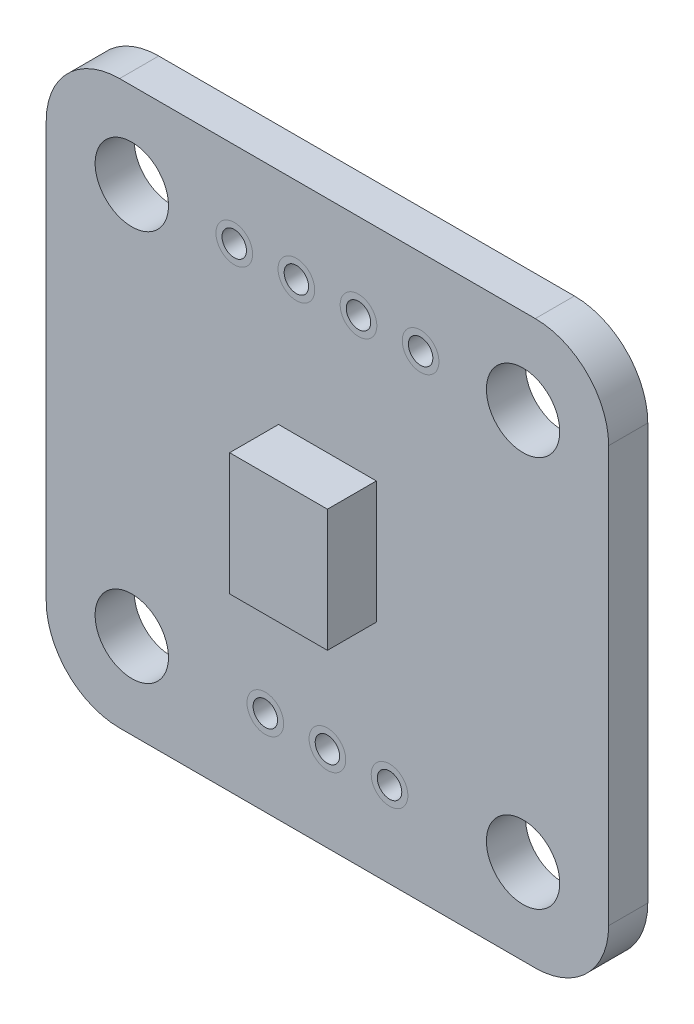
ISO-10303-21;
HEADER;
FILE_DESCRIPTION(('STEP AP214'),'2;1');
FILE_NAME('part.step','',(''),(''),'','','');
FILE_SCHEMA(('AUTOMOTIVE_DESIGN { 1 0 10303 214 1 1 1 1 }'));
ENDSEC;
DATA;
#1=APPLICATION_CONTEXT('core data for automotive mechanical design processes');
#2=APPLICATION_PROTOCOL_DEFINITION('international standard','automotive_design',2000,#1);
#3=PRODUCT_CONTEXT('',#1,'mechanical');
#4=PRODUCT('Part','Part','',(#3));
#5=PRODUCT_RELATED_PRODUCT_CATEGORY('part','',(#4));
#6=PRODUCT_DEFINITION_FORMATION('','',#4);
#7=PRODUCT_DEFINITION_CONTEXT('part definition',#1,'design');
#8=PRODUCT_DEFINITION('design','',#6,#7);
#9=PRODUCT_DEFINITION_SHAPE('','',#8);
#10=(LENGTH_UNIT() NAMED_UNIT(*) SI_UNIT(.MILLI.,.METRE.));
#11=(NAMED_UNIT(*) PLANE_ANGLE_UNIT() SI_UNIT($,.RADIAN.));
#12=(NAMED_UNIT(*) SI_UNIT($,.STERADIAN.) SOLID_ANGLE_UNIT());
#13=UNCERTAINTY_MEASURE_WITH_UNIT(LENGTH_MEASURE(1.E-05),#10,'distance_accuracy_value','');
#14=(GEOMETRIC_REPRESENTATION_CONTEXT(3) GLOBAL_UNCERTAINTY_ASSIGNED_CONTEXT((#13)) GLOBAL_UNIT_ASSIGNED_CONTEXT((#10,
#11,#12)) REPRESENTATION_CONTEXT('',''));
#15=CARTESIAN_POINT('',(0.,0.,0.));
#16=DIRECTION('',(0.,0.,1.));
#17=DIRECTION('',(1.,0.,0.));
#18=AXIS2_PLACEMENT_3D('',#15,#16,#17);
#19=CARTESIAN_POINT('',(-8.50000000000001,-8.5,-0.8));
#20=DIRECTION('',(0.,0.,-1.));
#21=DIRECTION('',(-1.,0.,0.));
#22=AXIS2_PLACEMENT_3D('',#19,#20,#21);
#23=PLANE('',#22);
#24=CARTESIAN_POINT('',(0.,-7.99999999999999,-0.8));
#25=DIRECTION('',(0.,0.,-1.));
#26=DIRECTION('',(-1.,0.,0.));
#27=AXIS2_PLACEMENT_3D('',#24,#25,#26);
#28=CIRCLE('',#27,0.75);
#29=CARTESIAN_POINT('',(-0.75,-7.99999999999999,-0.8));
#30=VERTEX_POINT('',#29);
#31=EDGE_CURVE('E321',#30,#30,#28,.F.);
#32=ORIENTED_EDGE('',*,*,#31,.T.);
#33=EDGE_LOOP('',(#32));
#34=FACE_BOUND('',#33,.T.);
#35=CARTESIAN_POINT('',(3.81,7.99999999999999,-0.8));
#36=DIRECTION('',(0.,0.,-1.));
#37=DIRECTION('',(-1.,0.,0.));
#38=AXIS2_PLACEMENT_3D('',#35,#36,#37);
#39=CIRCLE('',#38,0.75);
#40=CARTESIAN_POINT('',(3.06,7.99999999999999,-0.8));
#41=VERTEX_POINT('',#40);
#42=EDGE_CURVE('E305',#41,#41,#39,.F.);
#43=ORIENTED_EDGE('',*,*,#42,.T.);
#44=EDGE_LOOP('',(#43));
#45=FACE_BOUND('',#44,.T.);
#46=CARTESIAN_POINT('',(-1.27,7.99999999999999,-0.8));
#47=DIRECTION('',(0.,0.,-1.));
#48=DIRECTION('',(-1.,0.,0.));
#49=AXIS2_PLACEMENT_3D('',#46,#47,#48);
#50=CIRCLE('',#49,0.75);
#51=CARTESIAN_POINT('',(-2.02,7.99999999999999,-0.8));
#52=VERTEX_POINT('',#51);
#53=EDGE_CURVE('E289',#52,#52,#50,.F.);
#54=ORIENTED_EDGE('',*,*,#53,.T.);
#55=EDGE_LOOP('',(#54));
#56=FACE_BOUND('',#55,.T.);
#57=CARTESIAN_POINT('',(8.,-7.99999999999999,-0.8));
#58=DIRECTION('',(0.,0.,1.));
#59=DIRECTION('',(1.,0.,0.));
#60=AXIS2_PLACEMENT_3D('',#57,#58,#59);
#61=CIRCLE('',#60,1.5);
#62=CARTESIAN_POINT('',(9.5,-7.99999999999999,-0.8));
#63=VERTEX_POINT('',#62);
#64=EDGE_CURVE('E202',#63,#63,#61,.T.);
#65=ORIENTED_EDGE('',*,*,#64,.T.);
#66=EDGE_LOOP('',(#65));
#67=FACE_BOUND('',#66,.T.);
#68=CARTESIAN_POINT('',(-8.,7.99999999999999,-0.8));
#69=DIRECTION('',(0.,0.,1.));
#70=DIRECTION('',(1.,0.,0.));
#71=AXIS2_PLACEMENT_3D('',#68,#69,#70);
#72=CIRCLE('',#71,1.5);
#73=CARTESIAN_POINT('',(-6.5,7.99999999999999,-0.8));
#74=VERTEX_POINT('',#73);
#75=EDGE_CURVE('E214',#74,#74,#72,.T.);
#76=ORIENTED_EDGE('',*,*,#75,.T.);
#77=EDGE_LOOP('',(#76));
#78=FACE_BOUND('',#77,.T.);
#79=CARTESIAN_POINT('',(-8.50000000000001,-8.5,-0.8));
#80=DIRECTION('',(0.,0.,1.));
#81=DIRECTION('',(-1.,0.,0.));
#82=AXIS2_PLACEMENT_3D('',#79,#80,#81);
#83=CIRCLE('',#82,3.);
#84=CARTESIAN_POINT('',(-11.5,-8.49999999999998,-0.8));
#85=VERTEX_POINT('',#84);
#86=CARTESIAN_POINT('',(-8.49999999999998,-11.5,-0.8));
#87=VERTEX_POINT('',#86);
#88=EDGE_CURVE('E220',#85,#87,#83,.T.);
#89=ORIENTED_EDGE('',*,*,#88,.F.);
#90=DIRECTION('',(0.,-1.,0.));
#91=VECTOR('',#90,1.);
#92=CARTESIAN_POINT('',(-11.5,-8.49999999999998,-0.8));
#93=LINE('',#92,#91);
#94=CARTESIAN_POINT('',(-11.5,8.49999999999998,-0.8));
#95=VERTEX_POINT('',#94);
#96=EDGE_CURVE('E227',#95,#85,#93,.T.);
#97=ORIENTED_EDGE('',*,*,#96,.F.);
#98=CARTESIAN_POINT('',(-8.50000000000001,8.5,-0.8));
#99=DIRECTION('',(0.,0.,1.));
#100=DIRECTION('',(-1.,0.,0.));
#101=AXIS2_PLACEMENT_3D('',#98,#99,#100);
#102=CIRCLE('',#101,3.);
#103=CARTESIAN_POINT('',(-8.49999999999998,11.5,-0.8));
#104=VERTEX_POINT('',#103);
#105=EDGE_CURVE('E254',#104,#95,#102,.T.);
#106=ORIENTED_EDGE('',*,*,#105,.F.);
#107=DIRECTION('',(-1.,0.,0.));
#108=VECTOR('',#107,1.);
#109=CARTESIAN_POINT('',(-8.49999999999998,11.5,-0.8));
#110=LINE('',#109,#108);
#111=CARTESIAN_POINT('',(8.49999999999997,11.5,-0.8));
#112=VERTEX_POINT('',#111);
#113=EDGE_CURVE('E252',#112,#104,#110,.T.);
#114=ORIENTED_EDGE('',*,*,#113,.F.);
#115=CARTESIAN_POINT('',(8.49999999999999,8.5,-0.8));
#116=DIRECTION('',(0.,0.,1.));
#117=DIRECTION('',(-1.,0.,0.));
#118=AXIS2_PLACEMENT_3D('',#115,#116,#117);
#119=CIRCLE('',#118,3.);
#120=CARTESIAN_POINT('',(11.5,8.49999999999998,-0.8));
#121=VERTEX_POINT('',#120);
#122=EDGE_CURVE('E250',#121,#112,#119,.T.);
#123=ORIENTED_EDGE('',*,*,#122,.F.);
#124=DIRECTION('',(0.,1.,0.));
#125=VECTOR('',#124,1.);
#126=CARTESIAN_POINT('',(11.5,-8.49999999999998,-0.8));
#127=LINE('',#126,#125);
#128=CARTESIAN_POINT('',(11.5,-8.5,-0.8));
#129=VERTEX_POINT('',#128);
#130=EDGE_CURVE('E248',#129,#121,#127,.T.);
#131=ORIENTED_EDGE('',*,*,#130,.F.);
#132=CARTESIAN_POINT('',(8.49999999999999,-8.5,-0.8));
#133=DIRECTION('',(0.,0.,1.));
#134=DIRECTION('',(1.,0.,0.));
#135=AXIS2_PLACEMENT_3D('',#132,#133,#134);
#136=CIRCLE('',#135,3.);
#137=CARTESIAN_POINT('',(8.49999999999997,-11.5,-0.8));
#138=VERTEX_POINT('',#137);
#139=EDGE_CURVE('E246',#138,#129,#136,.T.);
#140=ORIENTED_EDGE('',*,*,#139,.F.);
#141=DIRECTION('',(1.,0.,0.));
#142=VECTOR('',#141,1.);
#143=CARTESIAN_POINT('',(-8.49999999999998,-11.5,-0.8));
#144=LINE('',#143,#142);
#145=EDGE_CURVE('E244',#87,#138,#144,.T.);
#146=ORIENTED_EDGE('',*,*,#145,.F.);
#147=EDGE_LOOP('',(#89,#97,#106,#114,#123,#131,#140,#146));
#148=FACE_BOUND('',#147,.T.);
#149=CARTESIAN_POINT('',(8.,7.99999999999999,-0.8));
#150=DIRECTION('',(0.,0.,1.));
#151=DIRECTION('',(1.,0.,0.));
#152=AXIS2_PLACEMENT_3D('',#149,#150,#151);
#153=CIRCLE('',#152,1.5);
#154=CARTESIAN_POINT('',(9.5,7.99999999999999,-0.8));
#155=VERTEX_POINT('',#154);
#156=EDGE_CURVE('E208',#155,#155,#153,.T.);
#157=ORIENTED_EDGE('',*,*,#156,.T.);
#158=EDGE_LOOP('',(#157));
#159=FACE_BOUND('',#158,.T.);
#160=CARTESIAN_POINT('',(-8.,-7.99999999999999,-0.8));
#161=DIRECTION('',(0.,0.,1.));
#162=DIRECTION('',(1.,0.,0.));
#163=AXIS2_PLACEMENT_3D('',#160,#161,#162);
#164=CIRCLE('',#163,1.5);
#165=CARTESIAN_POINT('',(-6.5,-7.99999999999999,-0.8));
#166=VERTEX_POINT('',#165);
#167=EDGE_CURVE('E196',#166,#166,#164,.T.);
#168=ORIENTED_EDGE('',*,*,#167,.T.);
#169=EDGE_LOOP('',(#168));
#170=FACE_BOUND('',#169,.T.);
#171=CARTESIAN_POINT('',(-3.81,7.99999999999999,-0.8));
#172=DIRECTION('',(0.,0.,-1.));
#173=DIRECTION('',(-1.,0.,0.));
#174=AXIS2_PLACEMENT_3D('',#171,#172,#173);
#175=CIRCLE('',#174,0.75);
#176=CARTESIAN_POINT('',(-4.56,7.99999999999999,-0.8));
#177=VERTEX_POINT('',#176);
#178=EDGE_CURVE('E281',#177,#177,#175,.F.);
#179=ORIENTED_EDGE('',*,*,#178,.T.);
#180=EDGE_LOOP('',(#179));
#181=FACE_BOUND('',#180,.T.);
#182=CARTESIAN_POINT('',(1.27,7.99999999999999,-0.8));
#183=DIRECTION('',(0.,0.,-1.));
#184=DIRECTION('',(-1.,0.,0.));
#185=AXIS2_PLACEMENT_3D('',#182,#183,#184);
#186=CIRCLE('',#185,0.75);
#187=CARTESIAN_POINT('',(0.519999999999999,7.99999999999999,-0.8));
#188=VERTEX_POINT('',#187);
#189=EDGE_CURVE('E297',#188,#188,#186,.F.);
#190=ORIENTED_EDGE('',*,*,#189,.T.);
#191=EDGE_LOOP('',(#190));
#192=FACE_BOUND('',#191,.T.);
#193=CARTESIAN_POINT('',(-2.54,-7.99999999999999,-0.8));
#194=DIRECTION('',(0.,0.,-1.));
#195=DIRECTION('',(-1.,0.,0.));
#196=AXIS2_PLACEMENT_3D('',#193,#194,#195);
#197=CIRCLE('',#196,0.75);
#198=CARTESIAN_POINT('',(-3.29,-7.99999999999999,-0.8));
#199=VERTEX_POINT('',#198);
#200=EDGE_CURVE('E313',#199,#199,#197,.F.);
#201=ORIENTED_EDGE('',*,*,#200,.T.);
#202=EDGE_LOOP('',(#201));
#203=FACE_BOUND('',#202,.T.);
#204=CARTESIAN_POINT('',(2.54,-7.99999999999999,-0.8));
#205=DIRECTION('',(0.,0.,-1.));
#206=DIRECTION('',(-1.,0.,0.));
#207=AXIS2_PLACEMENT_3D('',#204,#205,#206);
#208=CIRCLE('',#207,0.75);
#209=CARTESIAN_POINT('',(1.79,-7.99999999999999,-0.8));
#210=VERTEX_POINT('',#209);
#211=EDGE_CURVE('E11',#210,#210,#208,.F.);
#212=ORIENTED_EDGE('',*,*,#211,.T.);
#213=EDGE_LOOP('',(#212));
#214=FACE_BOUND('',#213,.T.);
#215=ADVANCED_FACE('F40',(#34,#45,#56,#67,#78,#148,#159,#170,#181,#192,#203,#214),#23,.T.);
#216=CARTESIAN_POINT('',(-8.50000000000001,-8.5,0.8));
#217=DIRECTION('',(0.,0.,-1.));
#218=DIRECTION('',(-1.,0.,0.));
#219=AXIS2_PLACEMENT_3D('',#216,#217,#218);
#220=PLANE('',#219);
#221=CARTESIAN_POINT('',(0.,-7.99999999999999,0.8));
#222=DIRECTION('',(0.,0.,-1.));
#223=DIRECTION('',(-1.,0.,0.));
#224=AXIS2_PLACEMENT_3D('',#221,#222,#223);
#225=CIRCLE('',#224,0.75);
#226=CARTESIAN_POINT('',(-0.75,-7.99999999999999,0.8));
#227=VERTEX_POINT('',#226);
#228=EDGE_CURVE('E317',#227,#227,#225,.F.);
#229=ORIENTED_EDGE('',*,*,#228,.F.);
#230=EDGE_LOOP('',(#229));
#231=FACE_BOUND('',#230,.T.);
#232=CARTESIAN_POINT('',(3.81,7.99999999999999,0.8));
#233=DIRECTION('',(0.,0.,-1.));
#234=DIRECTION('',(-1.,0.,0.));
#235=AXIS2_PLACEMENT_3D('',#232,#233,#234);
#236=CIRCLE('',#235,0.75);
#237=CARTESIAN_POINT('',(3.06,7.99999999999999,0.8));
#238=VERTEX_POINT('',#237);
#239=EDGE_CURVE('E301',#238,#238,#236,.F.);
#240=ORIENTED_EDGE('',*,*,#239,.F.);
#241=EDGE_LOOP('',(#240));
#242=FACE_BOUND('',#241,.T.);
#243=CARTESIAN_POINT('',(-1.27,7.99999999999999,0.8));
#244=DIRECTION('',(0.,0.,-1.));
#245=DIRECTION('',(-1.,0.,0.));
#246=AXIS2_PLACEMENT_3D('',#243,#244,#245);
#247=CIRCLE('',#246,0.75);
#248=CARTESIAN_POINT('',(-2.02,7.99999999999999,0.8));
#249=VERTEX_POINT('',#248);
#250=EDGE_CURVE('E285',#249,#249,#247,.F.);
#251=ORIENTED_EDGE('',*,*,#250,.F.);
#252=EDGE_LOOP('',(#251));
#253=FACE_BOUND('',#252,.T.);
#254=DIRECTION('',(0.,1.,0.));
#255=VECTOR('',#254,1.);
#256=CARTESIAN_POINT('',(2.,2.5,0.8));
#257=LINE('',#256,#255);
#258=CARTESIAN_POINT('',(2.,-2.5,0.8));
#259=VERTEX_POINT('',#258);
#260=CARTESIAN_POINT('',(2.,2.5,0.8));
#261=VERTEX_POINT('',#260);
#262=EDGE_CURVE('E150',#259,#261,#257,.T.);
#263=ORIENTED_EDGE('',*,*,#262,.F.);
#264=DIRECTION('',(1.,0.,0.));
#265=VECTOR('',#264,1.);
#266=CARTESIAN_POINT('',(-2.,-2.5,0.8));
#267=LINE('',#266,#265);
#268=CARTESIAN_POINT('',(-2.,-2.5,0.8));
#269=VERTEX_POINT('',#268);
#270=EDGE_CURVE('E147',#269,#259,#267,.T.);
#271=ORIENTED_EDGE('',*,*,#270,.F.);
#272=DIRECTION('',(0.,-1.,0.));
#273=VECTOR('',#272,1.);
#274=CARTESIAN_POINT('',(-2.,2.5,0.8));
#275=LINE('',#274,#273);
#276=CARTESIAN_POINT('',(-2.,2.5,0.8));
#277=VERTEX_POINT('',#276);
#278=EDGE_CURVE('E61',#277,#269,#275,.T.);
#279=ORIENTED_EDGE('',*,*,#278,.F.);
#280=DIRECTION('',(-1.,0.,0.));
#281=VECTOR('',#280,1.);
#282=CARTESIAN_POINT('',(-2.,2.5,0.8));
#283=LINE('',#282,#281);
#284=EDGE_CURVE('E56',#261,#277,#283,.T.);
#285=ORIENTED_EDGE('',*,*,#284,.F.);
#286=EDGE_LOOP('',(#263,#271,#279,#285));
#287=FACE_BOUND('',#286,.T.);
#288=CARTESIAN_POINT('',(-8.50000000000001,-8.5,0.8));
#289=DIRECTION('',(0.,0.,1.));
#290=DIRECTION('',(-1.,0.,0.));
#291=AXIS2_PLACEMENT_3D('',#288,#289,#290);
#292=CIRCLE('',#291,3.);
#293=CARTESIAN_POINT('',(-11.5,-8.49999999999998,0.8));
#294=VERTEX_POINT('',#293);
#295=CARTESIAN_POINT('',(-8.49999999999998,-11.5,0.8));
#296=VERTEX_POINT('',#295);
#297=EDGE_CURVE('E223',#294,#296,#292,.T.);
#298=ORIENTED_EDGE('',*,*,#297,.T.);
#299=DIRECTION('',(1.,0.,0.));
#300=VECTOR('',#299,1.);
#301=CARTESIAN_POINT('',(-8.49999999999998,-11.5,0.8));
#302=LINE('',#301,#300);
#303=CARTESIAN_POINT('',(8.49999999999997,-11.5,0.8));
#304=VERTEX_POINT('',#303);
#305=EDGE_CURVE('E226',#296,#304,#302,.T.);
#306=ORIENTED_EDGE('',*,*,#305,.T.);
#307=CARTESIAN_POINT('',(8.49999999999999,-8.5,0.8));
#308=DIRECTION('',(0.,0.,1.));
#309=DIRECTION('',(1.,0.,0.));
#310=AXIS2_PLACEMENT_3D('',#307,#308,#309);
#311=CIRCLE('',#310,3.);
#312=CARTESIAN_POINT('',(11.5,-8.5,0.8));
#313=VERTEX_POINT('',#312);
#314=EDGE_CURVE('E229',#304,#313,#311,.T.);
#315=ORIENTED_EDGE('',*,*,#314,.T.);
#316=DIRECTION('',(0.,1.,0.));
#317=VECTOR('',#316,1.);
#318=CARTESIAN_POINT('',(11.5,-8.49999999999998,0.8));
#319=LINE('',#318,#317);
#320=CARTESIAN_POINT('',(11.5,8.49999999999998,0.8));
#321=VERTEX_POINT('',#320);
#322=EDGE_CURVE('E231',#313,#321,#319,.T.);
#323=ORIENTED_EDGE('',*,*,#322,.T.);
#324=CARTESIAN_POINT('',(8.49999999999999,8.5,0.8));
#325=DIRECTION('',(0.,0.,1.));
#326=DIRECTION('',(-1.,0.,0.));
#327=AXIS2_PLACEMENT_3D('',#324,#325,#326);
#328=CIRCLE('',#327,3.);
#329=CARTESIAN_POINT('',(8.49999999999997,11.5,0.8));
#330=VERTEX_POINT('',#329);
#331=EDGE_CURVE('E233',#321,#330,#328,.T.);
#332=ORIENTED_EDGE('',*,*,#331,.T.);
#333=DIRECTION('',(-1.,0.,0.));
#334=VECTOR('',#333,1.);
#335=CARTESIAN_POINT('',(-8.49999999999998,11.5,0.8));
#336=LINE('',#335,#334);
#337=CARTESIAN_POINT('',(-8.49999999999998,11.5,0.8));
#338=VERTEX_POINT('',#337);
#339=EDGE_CURVE('E235',#330,#338,#336,.T.);
#340=ORIENTED_EDGE('',*,*,#339,.T.);
#341=CARTESIAN_POINT('',(-8.50000000000001,8.5,0.8));
#342=DIRECTION('',(0.,0.,1.));
#343=DIRECTION('',(-1.,0.,0.));
#344=AXIS2_PLACEMENT_3D('',#341,#342,#343);
#345=CIRCLE('',#344,3.);
#346=CARTESIAN_POINT('',(-11.5,8.49999999999998,0.8));
#347=VERTEX_POINT('',#346);
#348=EDGE_CURVE('E237',#338,#347,#345,.T.);
#349=ORIENTED_EDGE('',*,*,#348,.T.);
#350=DIRECTION('',(0.,-1.,0.));
#351=VECTOR('',#350,1.);
#352=CARTESIAN_POINT('',(-11.5,-8.49999999999998,0.8));
#353=LINE('',#352,#351);
#354=EDGE_CURVE('E239',#347,#294,#353,.T.);
#355=ORIENTED_EDGE('',*,*,#354,.T.);
#356=EDGE_LOOP('',(#298,#306,#315,#323,#332,#340,#349,#355));
#357=FACE_BOUND('',#356,.T.);
#358=CARTESIAN_POINT('',(-8.,7.99999999999999,0.8));
#359=DIRECTION('',(0.,0.,1.));
#360=DIRECTION('',(1.,0.,0.));
#361=AXIS2_PLACEMENT_3D('',#358,#359,#360);
#362=CIRCLE('',#361,1.5);
#363=CARTESIAN_POINT('',(-6.5,7.99999999999999,0.8));
#364=VERTEX_POINT('',#363);
#365=EDGE_CURVE('E217',#364,#364,#362,.T.);
#366=ORIENTED_EDGE('',*,*,#365,.F.);
#367=EDGE_LOOP('',(#366));
#368=FACE_BOUND('',#367,.T.);
#369=CARTESIAN_POINT('',(8.,7.99999999999999,0.8));
#370=DIRECTION('',(0.,0.,1.));
#371=DIRECTION('',(1.,0.,0.));
#372=AXIS2_PLACEMENT_3D('',#369,#370,#371);
#373=CIRCLE('',#372,1.5);
#374=CARTESIAN_POINT('',(9.5,7.99999999999999,0.8));
#375=VERTEX_POINT('',#374);
#376=EDGE_CURVE('E211',#375,#375,#373,.T.);
#377=ORIENTED_EDGE('',*,*,#376,.F.);
#378=EDGE_LOOP('',(#377));
#379=FACE_BOUND('',#378,.T.);
#380=CARTESIAN_POINT('',(8.,-7.99999999999999,0.8));
#381=DIRECTION('',(0.,0.,1.));
#382=DIRECTION('',(1.,0.,0.));
#383=AXIS2_PLACEMENT_3D('',#380,#381,#382);
#384=CIRCLE('',#383,1.5);
#385=CARTESIAN_POINT('',(9.5,-7.99999999999999,0.8));
#386=VERTEX_POINT('',#385);
#387=EDGE_CURVE('E205',#386,#386,#384,.T.);
#388=ORIENTED_EDGE('',*,*,#387,.F.);
#389=EDGE_LOOP('',(#388));
#390=FACE_BOUND('',#389,.T.);
#391=CARTESIAN_POINT('',(-8.,-7.99999999999999,0.8));
#392=DIRECTION('',(0.,0.,1.));
#393=DIRECTION('',(1.,0.,0.));
#394=AXIS2_PLACEMENT_3D('',#391,#392,#393);
#395=CIRCLE('',#394,1.5);
#396=CARTESIAN_POINT('',(-6.5,-7.99999999999999,0.8));
#397=VERTEX_POINT('',#396);
#398=EDGE_CURVE('E199',#397,#397,#395,.T.);
#399=ORIENTED_EDGE('',*,*,#398,.F.);
#400=EDGE_LOOP('',(#399));
#401=FACE_BOUND('',#400,.T.);
#402=CARTESIAN_POINT('',(-3.81,7.99999999999999,0.8));
#403=DIRECTION('',(0.,0.,-1.));
#404=DIRECTION('',(-1.,0.,0.));
#405=AXIS2_PLACEMENT_3D('',#402,#403,#404);
#406=CIRCLE('',#405,0.75);
#407=CARTESIAN_POINT('',(-4.56,7.99999999999999,0.8));
#408=VERTEX_POINT('',#407);
#409=EDGE_CURVE('E280',#408,#408,#406,.F.);
#410=ORIENTED_EDGE('',*,*,#409,.F.);
#411=EDGE_LOOP('',(#410));
#412=FACE_BOUND('',#411,.T.);
#413=CARTESIAN_POINT('',(1.27,7.99999999999999,0.8));
#414=DIRECTION('',(0.,0.,-1.));
#415=DIRECTION('',(-1.,0.,0.));
#416=AXIS2_PLACEMENT_3D('',#413,#414,#415);
#417=CIRCLE('',#416,0.75);
#418=CARTESIAN_POINT('',(0.519999999999999,7.99999999999999,0.8));
#419=VERTEX_POINT('',#418);
#420=EDGE_CURVE('E293',#419,#419,#417,.F.);
#421=ORIENTED_EDGE('',*,*,#420,.F.);
#422=EDGE_LOOP('',(#421));
#423=FACE_BOUND('',#422,.T.);
#424=CARTESIAN_POINT('',(-2.54,-7.99999999999999,0.8));
#425=DIRECTION('',(0.,0.,-1.));
#426=DIRECTION('',(-1.,0.,0.));
#427=AXIS2_PLACEMENT_3D('',#424,#425,#426);
#428=CIRCLE('',#427,0.75);
#429=CARTESIAN_POINT('',(-3.29,-7.99999999999999,0.8));
#430=VERTEX_POINT('',#429);
#431=EDGE_CURVE('E309',#430,#430,#428,.F.);
#432=ORIENTED_EDGE('',*,*,#431,.F.);
#433=EDGE_LOOP('',(#432));
#434=FACE_BOUND('',#433,.T.);
#435=CARTESIAN_POINT('',(2.54,-7.99999999999999,0.8));
#436=DIRECTION('',(0.,0.,-1.));
#437=DIRECTION('',(-1.,0.,0.));
#438=AXIS2_PLACEMENT_3D('',#435,#436,#437);
#439=CIRCLE('',#438,0.75);
#440=CARTESIAN_POINT('',(1.79,-7.99999999999999,0.8));
#441=VERTEX_POINT('',#440);
#442=EDGE_CURVE('E44',#441,#441,#439,.F.);
#443=ORIENTED_EDGE('',*,*,#442,.F.);
#444=EDGE_LOOP('',(#443));
#445=FACE_BOUND('',#444,.T.);
#446=ADVANCED_FACE('F334',(#231,#242,#253,#287,#357,#368,#379,#390,#401,#412,#423,#434,#445),
#220,.F.);
#447=ORIENTED_EDGE('',*,*,#211,.F.);
#448=EDGE_LOOP('',(#447));
#449=FACE_BOUND('',#448,.T.);
#450=CARTESIAN_POINT('',(2.54,-7.99999999999999,-0.8));
#451=DIRECTION('',(0.,0.,1.));
#452=DIRECTION('',(1.,0.,0.));
#453=AXIS2_PLACEMENT_3D('',#450,#451,#452);
#454=CIRCLE('',#453,0.5);
#455=CARTESIAN_POINT('',(3.04,-7.99999999999999,-0.8));
#456=VERTEX_POINT('',#455);
#457=EDGE_CURVE('E178',#456,#456,#454,.T.);
#458=ORIENTED_EDGE('',*,*,#457,.T.);
#459=EDGE_LOOP('',(#458));
#460=FACE_BOUND('',#459,.T.);
#461=ADVANCED_FACE('F337',(#449,#460),#23,.T.);
#462=ORIENTED_EDGE('',*,*,#442,.T.);
#463=EDGE_LOOP('',(#462));
#464=FACE_BOUND('',#463,.T.);
#465=CARTESIAN_POINT('',(2.54,-7.99999999999999,0.8));
#466=DIRECTION('',(0.,0.,1.));
#467=DIRECTION('',(1.,0.,0.));
#468=AXIS2_PLACEMENT_3D('',#465,#466,#467);
#469=CIRCLE('',#468,0.5);
#470=CARTESIAN_POINT('',(3.04,-7.99999999999999,0.8));
#471=VERTEX_POINT('',#470);
#472=EDGE_CURVE('E181',#471,#471,#469,.T.);
#473=ORIENTED_EDGE('',*,*,#472,.F.);
#474=EDGE_LOOP('',(#473));
#475=FACE_BOUND('',#474,.T.);
#476=ADVANCED_FACE('F339',(#464,#475),#220,.F.);
#477=ORIENTED_EDGE('',*,*,#31,.F.);
#478=EDGE_LOOP('',(#477));
#479=FACE_BOUND('',#478,.T.);
#480=CARTESIAN_POINT('',(0.,-7.99999999999999,-0.8));
#481=DIRECTION('',(0.,0.,1.));
#482=DIRECTION('',(1.,0.,0.));
#483=AXIS2_PLACEMENT_3D('',#480,#481,#482);
#484=CIRCLE('',#483,0.5);
#485=CARTESIAN_POINT('',(0.5,-7.99999999999999,-0.8));
#486=VERTEX_POINT('',#485);
#487=EDGE_CURVE('E190',#486,#486,#484,.T.);
#488=ORIENTED_EDGE('',*,*,#487,.T.);
#489=EDGE_LOOP('',(#488));
#490=FACE_BOUND('',#489,.T.);
#491=ADVANCED_FACE('F375',(#479,#490),#23,.T.);
#492=ORIENTED_EDGE('',*,*,#228,.T.);
#493=EDGE_LOOP('',(#492));
#494=FACE_BOUND('',#493,.T.);
#495=CARTESIAN_POINT('',(0.,-7.99999999999999,0.8));
#496=DIRECTION('',(0.,0.,1.));
#497=DIRECTION('',(1.,0.,0.));
#498=AXIS2_PLACEMENT_3D('',#495,#496,#497);
#499=CIRCLE('',#498,0.5);
#500=CARTESIAN_POINT('',(0.5,-7.99999999999999,0.8));
#501=VERTEX_POINT('',#500);
#502=EDGE_CURVE('E193',#501,#501,#499,.T.);
#503=ORIENTED_EDGE('',*,*,#502,.F.);
#504=EDGE_LOOP('',(#503));
#505=FACE_BOUND('',#504,.T.);
#506=ADVANCED_FACE('F331',(#494,#505),#220,.F.);
#507=ORIENTED_EDGE('',*,*,#200,.F.);
#508=EDGE_LOOP('',(#507));
#509=FACE_BOUND('',#508,.T.);
#510=CARTESIAN_POINT('',(-2.54,-7.99999999999999,-0.8));
#511=DIRECTION('',(0.,0.,1.));
#512=DIRECTION('',(1.,0.,0.));
#513=AXIS2_PLACEMENT_3D('',#510,#511,#512);
#514=CIRCLE('',#513,0.5);
#515=CARTESIAN_POINT('',(-2.04,-7.99999999999999,-0.8));
#516=VERTEX_POINT('',#515);
#517=EDGE_CURVE('E184',#516,#516,#514,.T.);
#518=ORIENTED_EDGE('',*,*,#517,.T.);
#519=EDGE_LOOP('',(#518));
#520=FACE_BOUND('',#519,.T.);
#521=ADVANCED_FACE('F396',(#509,#520),#23,.T.);
#522=ORIENTED_EDGE('',*,*,#431,.T.);
#523=EDGE_LOOP('',(#522));
#524=FACE_BOUND('',#523,.T.);
#525=CARTESIAN_POINT('',(-2.54,-7.99999999999999,0.8));
#526=DIRECTION('',(0.,0.,1.));
#527=DIRECTION('',(1.,0.,0.));
#528=AXIS2_PLACEMENT_3D('',#525,#526,#527);
#529=CIRCLE('',#528,0.5);
#530=CARTESIAN_POINT('',(-2.04,-7.99999999999999,0.8));
#531=VERTEX_POINT('',#530);
#532=EDGE_CURVE('E187',#531,#531,#529,.T.);
#533=ORIENTED_EDGE('',*,*,#532,.F.);
#534=EDGE_LOOP('',(#533));
#535=FACE_BOUND('',#534,.T.);
#536=ADVANCED_FACE('F435',(#524,#535),#220,.F.);
#537=ORIENTED_EDGE('',*,*,#42,.F.);
#538=EDGE_LOOP('',(#537));
#539=FACE_BOUND('',#538,.T.);
#540=CARTESIAN_POINT('',(3.81,7.99999999999999,-0.8));
#541=DIRECTION('',(0.,0.,1.));
#542=DIRECTION('',(1.,0.,0.));
#543=AXIS2_PLACEMENT_3D('',#540,#541,#542);
#544=CIRCLE('',#543,0.500000000000001);
#545=CARTESIAN_POINT('',(4.31,7.99999999999999,-0.8));
#546=VERTEX_POINT('',#545);
#547=EDGE_CURVE('E151',#546,#546,#544,.T.);
#548=ORIENTED_EDGE('',*,*,#547,.T.);
#549=EDGE_LOOP('',(#548));
#550=FACE_BOUND('',#549,.T.);
#551=ADVANCED_FACE('F430',(#539,#550),#23,.T.);
#552=ORIENTED_EDGE('',*,*,#239,.T.);
#553=EDGE_LOOP('',(#552));
#554=FACE_BOUND('',#553,.T.);
#555=CARTESIAN_POINT('',(3.81,7.99999999999999,0.8));
#556=DIRECTION('',(0.,0.,1.));
#557=DIRECTION('',(1.,0.,0.));
#558=AXIS2_PLACEMENT_3D('',#555,#556,#557);
#559=CIRCLE('',#558,0.500000000000001);
#560=CARTESIAN_POINT('',(4.31,7.99999999999999,0.8));
#561=VERTEX_POINT('',#560);
#562=EDGE_CURVE('E154',#561,#561,#559,.T.);
#563=ORIENTED_EDGE('',*,*,#562,.F.);
#564=EDGE_LOOP('',(#563));
#565=FACE_BOUND('',#564,.T.);
#566=ADVANCED_FACE('F425',(#554,#565),#220,.F.);
#567=ORIENTED_EDGE('',*,*,#189,.F.);
#568=EDGE_LOOP('',(#567));
#569=FACE_BOUND('',#568,.T.);
#570=CARTESIAN_POINT('',(1.27,7.99999999999999,-0.8));
#571=DIRECTION('',(0.,0.,1.));
#572=DIRECTION('',(1.,0.,0.));
#573=AXIS2_PLACEMENT_3D('',#570,#571,#572);
#574=CIRCLE('',#573,0.5);
#575=CARTESIAN_POINT('',(1.77,7.99999999999999,-0.8));
#576=VERTEX_POINT('',#575);
#577=EDGE_CURVE('E166',#576,#576,#574,.T.);
#578=ORIENTED_EDGE('',*,*,#577,.T.);
#579=EDGE_LOOP('',(#578));
#580=FACE_BOUND('',#579,.T.);
#581=ADVANCED_FACE('F418',(#569,#580),#23,.T.);
#582=ORIENTED_EDGE('',*,*,#420,.T.);
#583=EDGE_LOOP('',(#582));
#584=FACE_BOUND('',#583,.T.);
#585=CARTESIAN_POINT('',(1.27,7.99999999999999,0.8));
#586=DIRECTION('',(0.,0.,1.));
#587=DIRECTION('',(1.,0.,0.));
#588=AXIS2_PLACEMENT_3D('',#585,#586,#587);
#589=CIRCLE('',#588,0.5);
#590=CARTESIAN_POINT('',(1.77,7.99999999999999,0.8));
#591=VERTEX_POINT('',#590);
#592=EDGE_CURVE('E169',#591,#591,#589,.T.);
#593=ORIENTED_EDGE('',*,*,#592,.F.);
#594=EDGE_LOOP('',(#593));
#595=FACE_BOUND('',#594,.T.);
#596=ADVANCED_FACE('F416',(#584,#595),#220,.F.);
#597=ORIENTED_EDGE('',*,*,#53,.F.);
#598=EDGE_LOOP('',(#597));
#599=FACE_BOUND('',#598,.T.);
#600=CARTESIAN_POINT('',(-1.27,7.99999999999999,-0.8));
#601=DIRECTION('',(0.,0.,1.));
#602=DIRECTION('',(1.,0.,0.));
#603=AXIS2_PLACEMENT_3D('',#600,#601,#602);
#604=CIRCLE('',#603,0.5);
#605=CARTESIAN_POINT('',(-0.770000000000001,7.99999999999999,-0.8));
#606=VERTEX_POINT('',#605);
#607=EDGE_CURVE('E172',#606,#606,#604,.T.);
#608=ORIENTED_EDGE('',*,*,#607,.T.);
#609=EDGE_LOOP('',(#608));
#610=FACE_BOUND('',#609,.T.);
#611=ADVANCED_FACE('F404',(#599,#610),#23,.T.);
#612=ORIENTED_EDGE('',*,*,#250,.T.);
#613=EDGE_LOOP('',(#612));
#614=FACE_BOUND('',#613,.T.);
#615=CARTESIAN_POINT('',(-1.27,7.99999999999999,0.8));
#616=DIRECTION('',(0.,0.,1.));
#617=DIRECTION('',(1.,0.,0.));
#618=AXIS2_PLACEMENT_3D('',#615,#616,#617);
#619=CIRCLE('',#618,0.5);
#620=CARTESIAN_POINT('',(-0.770000000000001,7.99999999999999,0.8));
#621=VERTEX_POINT('',#620);
#622=EDGE_CURVE('E175',#621,#621,#619,.T.);
#623=ORIENTED_EDGE('',*,*,#622,.F.);
#624=EDGE_LOOP('',(#623));
#625=FACE_BOUND('',#624,.T.);
#626=ADVANCED_FACE('F411',(#614,#625),#220,.F.);
#627=ORIENTED_EDGE('',*,*,#409,.T.);
#628=EDGE_LOOP('',(#627));
#629=FACE_BOUND('',#628,.T.);
#630=CARTESIAN_POINT('',(-3.81,7.99999999999999,0.8));
#631=DIRECTION('',(0.,0.,1.));
#632=DIRECTION('',(1.,0.,0.));
#633=AXIS2_PLACEMENT_3D('',#630,#631,#632);
#634=CIRCLE('',#633,0.5);
#635=CARTESIAN_POINT('',(-3.31,7.99999999999999,0.8));
#636=VERTEX_POINT('',#635);
#637=EDGE_CURVE('E163',#636,#636,#634,.T.);
#638=ORIENTED_EDGE('',*,*,#637,.F.);
#639=EDGE_LOOP('',(#638));
#640=FACE_BOUND('',#639,.T.);
#641=ADVANCED_FACE('F340',(#629,#640),#220,.F.);
#642=ORIENTED_EDGE('',*,*,#178,.F.);
#643=EDGE_LOOP('',(#642));
#644=FACE_BOUND('',#643,.T.);
#645=CARTESIAN_POINT('',(-3.81,7.99999999999999,-0.8));
#646=DIRECTION('',(0.,0.,1.));
#647=DIRECTION('',(1.,0.,0.));
#648=AXIS2_PLACEMENT_3D('',#645,#646,#647);
#649=CIRCLE('',#648,0.5);
#650=CARTESIAN_POINT('',(-3.31,7.99999999999999,-0.8));
#651=VERTEX_POINT('',#650);
#652=EDGE_CURVE('E161',#651,#651,#649,.T.);
#653=ORIENTED_EDGE('',*,*,#652,.T.);
#654=EDGE_LOOP('',(#653));
#655=FACE_BOUND('',#654,.T.);
#656=ADVANCED_FACE('F392',(#644,#655),#23,.T.);
#657=CARTESIAN_POINT('',(-8.50000000000001,-8.5,0.8));
#658=DIRECTION('',(0.,0.,-1.));
#659=DIRECTION('',(-1.,0.,0.));
#660=AXIS2_PLACEMENT_3D('',#657,#658,#659);
#661=CYLINDRICAL_SURFACE('',#660,3.);
#662=ORIENTED_EDGE('',*,*,#88,.T.);
#663=DIRECTION('',(0.,0.,-1.));
#664=VECTOR('',#663,1.);
#665=CARTESIAN_POINT('',(-8.49999999999998,-11.5,0.8));
#666=LINE('',#665,#664);
#667=EDGE_CURVE('E277',#296,#87,#666,.T.);
#668=ORIENTED_EDGE('',*,*,#667,.F.);
#669=ORIENTED_EDGE('',*,*,#297,.F.);
#670=DIRECTION('',(0.,0.,-1.));
#671=VECTOR('',#670,1.);
#672=CARTESIAN_POINT('',(-11.5,-8.49999999999998,0.8));
#673=LINE('',#672,#671);
#674=EDGE_CURVE('E241',#294,#85,#673,.T.);
#675=ORIENTED_EDGE('',*,*,#674,.T.);
#676=EDGE_LOOP('',(#662,#668,#669,#675));
#677=FACE_BOUND('',#676,.T.);
#678=ADVANCED_FACE('F42',(#677),#661,.T.);
#679=CARTESIAN_POINT('',(-8.49999999999998,-11.5,0.8));
#680=DIRECTION('',(0.,1.,0.));
#681=DIRECTION('',(0.,0.,1.));
#682=AXIS2_PLACEMENT_3D('',#679,#680,#681);
#683=PLANE('',#682);
#684=ORIENTED_EDGE('',*,*,#145,.T.);
#685=DIRECTION('',(0.,0.,-1.));
#686=VECTOR('',#685,1.);
#687=CARTESIAN_POINT('',(8.49999999999997,-11.5,0.8));
#688=LINE('',#687,#686);
#689=EDGE_CURVE('E274',#304,#138,#688,.T.);
#690=ORIENTED_EDGE('',*,*,#689,.F.);
#691=ORIENTED_EDGE('',*,*,#305,.F.);
#692=ORIENTED_EDGE('',*,*,#667,.T.);
#693=EDGE_LOOP('',(#684,#690,#691,#692));
#694=FACE_BOUND('',#693,.T.);
#695=ADVANCED_FACE('F409',(#694),#683,.F.);
#696=CARTESIAN_POINT('',(8.49999999999999,-8.5,0.8));
#697=DIRECTION('',(0.,0.,-1.));
#698=DIRECTION('',(-1.,0.,0.));
#699=AXIS2_PLACEMENT_3D('',#696,#697,#698);
#700=CYLINDRICAL_SURFACE('',#699,3.);
#701=ORIENTED_EDGE('',*,*,#139,.T.);
#702=DIRECTION('',(0.,0.,-1.));
#703=VECTOR('',#702,1.);
#704=CARTESIAN_POINT('',(11.5,-8.5,0.8));
#705=LINE('',#704,#703);
#706=EDGE_CURVE('E271',#313,#129,#705,.T.);
#707=ORIENTED_EDGE('',*,*,#706,.F.);
#708=ORIENTED_EDGE('',*,*,#314,.F.);
#709=ORIENTED_EDGE('',*,*,#689,.T.);
#710=EDGE_LOOP('',(#701,#707,#708,#709));
#711=FACE_BOUND('',#710,.T.);
#712=ADVANCED_FACE('F527',(#711),#700,.T.);
#713=CARTESIAN_POINT('',(11.5,-8.49999999999998,0.8));
#714=DIRECTION('',(-1.,0.,0.));
#715=DIRECTION('',(0.,0.,1.));
#716=AXIS2_PLACEMENT_3D('',#713,#714,#715);
#717=PLANE('',#716);
#718=ORIENTED_EDGE('',*,*,#130,.T.);
#719=DIRECTION('',(0.,0.,-1.));
#720=VECTOR('',#719,1.);
#721=CARTESIAN_POINT('',(11.5,8.49999999999998,0.8));
#722=LINE('',#721,#720);
#723=EDGE_CURVE('E268',#321,#121,#722,.T.);
#724=ORIENTED_EDGE('',*,*,#723,.F.);
#725=ORIENTED_EDGE('',*,*,#322,.F.);
#726=ORIENTED_EDGE('',*,*,#706,.T.);
#727=EDGE_LOOP('',(#718,#724,#725,#726));
#728=FACE_BOUND('',#727,.T.);
#729=ADVANCED_FACE('F524',(#728),#717,.F.);
#730=CARTESIAN_POINT('',(8.49999999999999,8.5,0.8));
#731=DIRECTION('',(0.,0.,-1.));
#732=DIRECTION('',(-1.,0.,0.));
#733=AXIS2_PLACEMENT_3D('',#730,#731,#732);
#734=CYLINDRICAL_SURFACE('',#733,3.);
#735=ORIENTED_EDGE('',*,*,#122,.T.);
#736=DIRECTION('',(0.,0.,-1.));
#737=VECTOR('',#736,1.);
#738=CARTESIAN_POINT('',(8.49999999999997,11.5,0.8));
#739=LINE('',#738,#737);
#740=EDGE_CURVE('E265',#330,#112,#739,.T.);
#741=ORIENTED_EDGE('',*,*,#740,.F.);
#742=ORIENTED_EDGE('',*,*,#331,.F.);
#743=ORIENTED_EDGE('',*,*,#723,.T.);
#744=EDGE_LOOP('',(#735,#741,#742,#743));
#745=FACE_BOUND('',#744,.T.);
#746=ADVANCED_FACE('F520',(#745),#734,.T.);
#747=CARTESIAN_POINT('',(-8.49999999999998,11.5,0.8));
#748=DIRECTION('',(0.,-1.,0.));
#749=DIRECTION('',(0.,0.,-1.));
#750=AXIS2_PLACEMENT_3D('',#747,#748,#749);
#751=PLANE('',#750);
#752=ORIENTED_EDGE('',*,*,#113,.T.);
#753=DIRECTION('',(0.,0.,-1.));
#754=VECTOR('',#753,1.);
#755=CARTESIAN_POINT('',(-8.49999999999998,11.5,0.8));
#756=LINE('',#755,#754);
#757=EDGE_CURVE('E262',#338,#104,#756,.T.);
#758=ORIENTED_EDGE('',*,*,#757,.F.);
#759=ORIENTED_EDGE('',*,*,#339,.F.);
#760=ORIENTED_EDGE('',*,*,#740,.T.);
#761=EDGE_LOOP('',(#752,#758,#759,#760));
#762=FACE_BOUND('',#761,.T.);
#763=ADVANCED_FACE('F515',(#762),#751,.F.);
#764=CARTESIAN_POINT('',(-8.50000000000001,8.5,0.8));
#765=DIRECTION('',(0.,0.,-1.));
#766=DIRECTION('',(-1.,0.,0.));
#767=AXIS2_PLACEMENT_3D('',#764,#765,#766);
#768=CYLINDRICAL_SURFACE('',#767,3.);
#769=ORIENTED_EDGE('',*,*,#105,.T.);
#770=DIRECTION('',(0.,0.,-1.));
#771=VECTOR('',#770,1.);
#772=CARTESIAN_POINT('',(-11.5,8.49999999999998,0.8));
#773=LINE('',#772,#771);
#774=EDGE_CURVE('E259',#347,#95,#773,.T.);
#775=ORIENTED_EDGE('',*,*,#774,.F.);
#776=ORIENTED_EDGE('',*,*,#348,.F.);
#777=ORIENTED_EDGE('',*,*,#757,.T.);
#778=EDGE_LOOP('',(#769,#775,#776,#777));
#779=FACE_BOUND('',#778,.T.);
#780=ADVANCED_FACE('F485',(#779),#768,.T.);
#781=CARTESIAN_POINT('',(-11.5,-8.49999999999998,0.8));
#782=DIRECTION('',(1.,0.,0.));
#783=DIRECTION('',(0.,0.,-1.));
#784=AXIS2_PLACEMENT_3D('',#781,#782,#783);
#785=PLANE('',#784);
#786=ORIENTED_EDGE('',*,*,#96,.T.);
#787=ORIENTED_EDGE('',*,*,#674,.F.);
#788=ORIENTED_EDGE('',*,*,#354,.F.);
#789=ORIENTED_EDGE('',*,*,#774,.T.);
#790=EDGE_LOOP('',(#786,#787,#788,#789));
#791=FACE_BOUND('',#790,.T.);
#792=ADVANCED_FACE('F480',(#791),#785,.F.);
#793=CARTESIAN_POINT('',(-8.,7.99999999999999,0.8));
#794=DIRECTION('',(0.,0.,-1.));
#795=DIRECTION('',(-1.,0.,0.));
#796=AXIS2_PLACEMENT_3D('',#793,#794,#795);
#797=CYLINDRICAL_SURFACE('',#796,1.5);
#798=ORIENTED_EDGE('',*,*,#365,.T.);
#799=EDGE_LOOP('',(#798));
#800=FACE_BOUND('',#799,.T.);
#801=ORIENTED_EDGE('',*,*,#75,.F.);
#802=EDGE_LOOP('',(#801));
#803=FACE_BOUND('',#802,.T.);
#804=ADVANCED_FACE('F477',(#800,#803),#797,.F.);
#805=CARTESIAN_POINT('',(8.,7.99999999999999,0.8));
#806=DIRECTION('',(0.,0.,-1.));
#807=DIRECTION('',(-1.,0.,0.));
#808=AXIS2_PLACEMENT_3D('',#805,#806,#807);
#809=CYLINDRICAL_SURFACE('',#808,1.5);
#810=ORIENTED_EDGE('',*,*,#376,.T.);
#811=EDGE_LOOP('',(#810));
#812=FACE_BOUND('',#811,.T.);
#813=ORIENTED_EDGE('',*,*,#156,.F.);
#814=EDGE_LOOP('',(#813));
#815=FACE_BOUND('',#814,.T.);
#816=ADVANCED_FACE('F473',(#812,#815),#809,.F.);
#817=CARTESIAN_POINT('',(8.,-7.99999999999999,0.8));
#818=DIRECTION('',(0.,0.,-1.));
#819=DIRECTION('',(-1.,0.,0.));
#820=AXIS2_PLACEMENT_3D('',#817,#818,#819);
#821=CYLINDRICAL_SURFACE('',#820,1.5);
#822=ORIENTED_EDGE('',*,*,#387,.T.);
#823=EDGE_LOOP('',(#822));
#824=FACE_BOUND('',#823,.T.);
#825=ORIENTED_EDGE('',*,*,#64,.F.);
#826=EDGE_LOOP('',(#825));
#827=FACE_BOUND('',#826,.T.);
#828=ADVANCED_FACE('F469',(#824,#827),#821,.F.);
#829=CARTESIAN_POINT('',(-8.,-7.99999999999999,0.8));
#830=DIRECTION('',(0.,0.,-1.));
#831=DIRECTION('',(-1.,0.,0.));
#832=AXIS2_PLACEMENT_3D('',#829,#830,#831);
#833=CYLINDRICAL_SURFACE('',#832,1.5);
#834=ORIENTED_EDGE('',*,*,#398,.T.);
#835=EDGE_LOOP('',(#834));
#836=FACE_BOUND('',#835,.T.);
#837=ORIENTED_EDGE('',*,*,#167,.F.);
#838=EDGE_LOOP('',(#837));
#839=FACE_BOUND('',#838,.T.);
#840=ADVANCED_FACE('F462',(#836,#839),#833,.F.);
#841=CARTESIAN_POINT('',(0.,-7.99999999999999,0.8));
#842=DIRECTION('',(0.,0.,-1.));
#843=DIRECTION('',(-1.,0.,0.));
#844=AXIS2_PLACEMENT_3D('',#841,#842,#843);
#845=CYLINDRICAL_SURFACE('',#844,0.5);
#846=ORIENTED_EDGE('',*,*,#502,.T.);
#847=EDGE_LOOP('',(#846));
#848=FACE_BOUND('',#847,.T.);
#849=ORIENTED_EDGE('',*,*,#487,.F.);
#850=EDGE_LOOP('',(#849));
#851=FACE_BOUND('',#850,.T.);
#852=ADVANCED_FACE('F456',(#848,#851),#845,.F.);
#853=CARTESIAN_POINT('',(-2.54,-7.99999999999999,0.8));
#854=DIRECTION('',(0.,0.,-1.));
#855=DIRECTION('',(-1.,0.,0.));
#856=AXIS2_PLACEMENT_3D('',#853,#854,#855);
#857=CYLINDRICAL_SURFACE('',#856,0.5);
#858=ORIENTED_EDGE('',*,*,#532,.T.);
#859=EDGE_LOOP('',(#858));
#860=FACE_BOUND('',#859,.T.);
#861=ORIENTED_EDGE('',*,*,#517,.F.);
#862=EDGE_LOOP('',(#861));
#863=FACE_BOUND('',#862,.T.);
#864=ADVANCED_FACE('F382',(#860,#863),#857,.F.);
#865=CARTESIAN_POINT('',(2.54,-7.99999999999999,0.8));
#866=DIRECTION('',(0.,0.,-1.));
#867=DIRECTION('',(-1.,0.,0.));
#868=AXIS2_PLACEMENT_3D('',#865,#866,#867);
#869=CYLINDRICAL_SURFACE('',#868,0.5);
#870=ORIENTED_EDGE('',*,*,#472,.T.);
#871=EDGE_LOOP('',(#870));
#872=FACE_BOUND('',#871,.T.);
#873=ORIENTED_EDGE('',*,*,#457,.F.);
#874=EDGE_LOOP('',(#873));
#875=FACE_BOUND('',#874,.T.);
#876=ADVANCED_FACE('F378',(#872,#875),#869,.F.);
#877=CARTESIAN_POINT('',(-1.27,7.99999999999999,0.8));
#878=DIRECTION('',(0.,0.,-1.));
#879=DIRECTION('',(-1.,0.,0.));
#880=AXIS2_PLACEMENT_3D('',#877,#878,#879);
#881=CYLINDRICAL_SURFACE('',#880,0.5);
#882=ORIENTED_EDGE('',*,*,#622,.T.);
#883=EDGE_LOOP('',(#882));
#884=FACE_BOUND('',#883,.T.);
#885=ORIENTED_EDGE('',*,*,#607,.F.);
#886=EDGE_LOOP('',(#885));
#887=FACE_BOUND('',#886,.T.);
#888=ADVANCED_FACE('F381',(#884,#887),#881,.F.);
#889=CARTESIAN_POINT('',(1.27,7.99999999999999,0.8));
#890=DIRECTION('',(0.,0.,-1.));
#891=DIRECTION('',(-1.,0.,0.));
#892=AXIS2_PLACEMENT_3D('',#889,#890,#891);
#893=CYLINDRICAL_SURFACE('',#892,0.5);
#894=ORIENTED_EDGE('',*,*,#592,.T.);
#895=EDGE_LOOP('',(#894));
#896=FACE_BOUND('',#895,.T.);
#897=ORIENTED_EDGE('',*,*,#577,.F.);
#898=EDGE_LOOP('',(#897));
#899=FACE_BOUND('',#898,.T.);
#900=ADVANCED_FACE('F600',(#896,#899),#893,.F.);
#901=CARTESIAN_POINT('',(-3.81,7.99999999999999,0.8));
#902=DIRECTION('',(0.,0.,-1.));
#903=DIRECTION('',(-1.,0.,0.));
#904=AXIS2_PLACEMENT_3D('',#901,#902,#903);
#905=CYLINDRICAL_SURFACE('',#904,0.5);
#906=ORIENTED_EDGE('',*,*,#637,.T.);
#907=EDGE_LOOP('',(#906));
#908=FACE_BOUND('',#907,.T.);
#909=ORIENTED_EDGE('',*,*,#652,.F.);
#910=EDGE_LOOP('',(#909));
#911=FACE_BOUND('',#910,.T.);
#912=ADVANCED_FACE('F609',(#908,#911),#905,.F.);
#913=CARTESIAN_POINT('',(3.81,7.99999999999999,0.8));
#914=DIRECTION('',(0.,0.,-1.));
#915=DIRECTION('',(-1.,0.,0.));
#916=AXIS2_PLACEMENT_3D('',#913,#914,#915);
#917=CYLINDRICAL_SURFACE('',#916,0.500000000000001);
#918=ORIENTED_EDGE('',*,*,#562,.T.);
#919=EDGE_LOOP('',(#918));
#920=FACE_BOUND('',#919,.T.);
#921=ORIENTED_EDGE('',*,*,#547,.F.);
#922=EDGE_LOOP('',(#921));
#923=FACE_BOUND('',#922,.T.);
#924=ADVANCED_FACE('F619',(#920,#923),#917,.F.);
#925=CARTESIAN_POINT('',(2.,2.5,2.8));
#926=DIRECTION('',(-1.,0.,0.));
#927=DIRECTION('',(0.,-1.,0.));
#928=AXIS2_PLACEMENT_3D('',#925,#926,#927);
#929=PLANE('',#928);
#930=ORIENTED_EDGE('',*,*,#262,.T.);
#931=DIRECTION('',(0.,0.,-1.));
#932=VECTOR('',#931,1.);
#933=CARTESIAN_POINT('',(2.,2.5,2.8));
#934=LINE('',#933,#932);
#935=CARTESIAN_POINT('',(2.,2.5,2.8));
#936=VERTEX_POINT('',#935);
#937=EDGE_CURVE('E131',#936,#261,#934,.T.);
#938=ORIENTED_EDGE('',*,*,#937,.F.);
#939=DIRECTION('',(0.,1.,0.));
#940=VECTOR('',#939,1.);
#941=CARTESIAN_POINT('',(2.,2.5,2.8));
#942=LINE('',#941,#940);
#943=CARTESIAN_POINT('',(2.,-2.5,2.8));
#944=VERTEX_POINT('',#943);
#945=EDGE_CURVE('E138',#944,#936,#942,.T.);
#946=ORIENTED_EDGE('',*,*,#945,.F.);
#947=DIRECTION('',(0.,0.,-1.));
#948=VECTOR('',#947,1.);
#949=CARTESIAN_POINT('',(2.,-2.5,2.8));
#950=LINE('',#949,#948);
#951=EDGE_CURVE('E853',#944,#259,#950,.T.);
#952=ORIENTED_EDGE('',*,*,#951,.T.);
#953=EDGE_LOOP('',(#930,#938,#946,#952));
#954=FACE_BOUND('',#953,.T.);
#955=ADVANCED_FACE('F149',(#954),#929,.F.);
#956=CARTESIAN_POINT('',(-2.,2.5,2.8));
#957=DIRECTION('',(0.,-1.,0.));
#958=DIRECTION('',(0.,0.,-1.));
#959=AXIS2_PLACEMENT_3D('',#956,#957,#958);
#960=PLANE('',#959);
#961=ORIENTED_EDGE('',*,*,#284,.T.);
#962=DIRECTION('',(0.,0.,-1.));
#963=VECTOR('',#962,1.);
#964=CARTESIAN_POINT('',(-2.,2.5,2.8));
#965=LINE('',#964,#963);
#966=CARTESIAN_POINT('',(-2.,2.5,2.8));
#967=VERTEX_POINT('',#966);
#968=EDGE_CURVE('E134',#967,#277,#965,.T.);
#969=ORIENTED_EDGE('',*,*,#968,.F.);
#970=DIRECTION('',(-1.,0.,0.));
#971=VECTOR('',#970,1.);
#972=CARTESIAN_POINT('',(-2.,2.5,2.8));
#973=LINE('',#972,#971);
#974=EDGE_CURVE('E127',#936,#967,#973,.T.);
#975=ORIENTED_EDGE('',*,*,#974,.F.);
#976=ORIENTED_EDGE('',*,*,#937,.T.);
#977=EDGE_LOOP('',(#961,#969,#975,#976));
#978=FACE_BOUND('',#977,.T.);
#979=ADVANCED_FACE('F129',(#978),#960,.F.);
#980=CARTESIAN_POINT('',(-2.,2.5,2.8));
#981=DIRECTION('',(1.,0.,0.));
#982=DIRECTION('',(0.,1.,0.));
#983=AXIS2_PLACEMENT_3D('',#980,#981,#982);
#984=PLANE('',#983);
#985=ORIENTED_EDGE('',*,*,#278,.T.);
#986=DIRECTION('',(0.,0.,-1.));
#987=VECTOR('',#986,1.);
#988=CARTESIAN_POINT('',(-2.,-2.5,2.8));
#989=LINE('',#988,#987);
#990=CARTESIAN_POINT('',(-2.,-2.5,2.8));
#991=VERTEX_POINT('',#990);
#992=EDGE_CURVE('E156',#991,#269,#989,.T.);
#993=ORIENTED_EDGE('',*,*,#992,.F.);
#994=DIRECTION('',(0.,-1.,0.));
#995=VECTOR('',#994,1.);
#996=CARTESIAN_POINT('',(-2.,2.5,2.8));
#997=LINE('',#996,#995);
#998=EDGE_CURVE('E137',#967,#991,#997,.T.);
#999=ORIENTED_EDGE('',*,*,#998,.F.);
#1000=ORIENTED_EDGE('',*,*,#968,.T.);
#1001=EDGE_LOOP('',(#985,#993,#999,#1000));
#1002=FACE_BOUND('',#1001,.T.);
#1003=ADVANCED_FACE('F646',(#1002),#984,.F.);
#1004=CARTESIAN_POINT('',(-2.,-2.5,2.8));
#1005=DIRECTION('',(0.,1.,0.));
#1006=DIRECTION('',(0.,0.,1.));
#1007=AXIS2_PLACEMENT_3D('',#1004,#1005,#1006);
#1008=PLANE('',#1007);
#1009=ORIENTED_EDGE('',*,*,#270,.T.);
#1010=ORIENTED_EDGE('',*,*,#951,.F.);
#1011=DIRECTION('',(1.,0.,0.));
#1012=VECTOR('',#1011,1.);
#1013=CARTESIAN_POINT('',(-2.,-2.5,2.8));
#1014=LINE('',#1013,#1012);
#1015=EDGE_CURVE('E143',#991,#944,#1014,.T.);
#1016=ORIENTED_EDGE('',*,*,#1015,.F.);
#1017=ORIENTED_EDGE('',*,*,#992,.T.);
#1018=EDGE_LOOP('',(#1009,#1010,#1016,#1017));
#1019=FACE_BOUND('',#1018,.T.);
#1020=ADVANCED_FACE('F655',(#1019),#1008,.F.);
#1021=CARTESIAN_POINT('',(0.,0.,2.8));
#1022=DIRECTION('',(0.,0.,1.));
#1023=DIRECTION('',(1.,0.,0.));
#1024=AXIS2_PLACEMENT_3D('',#1021,#1022,#1023);
#1025=PLANE('',#1024);
#1026=ORIENTED_EDGE('',*,*,#945,.T.);
#1027=ORIENTED_EDGE('',*,*,#974,.T.);
#1028=ORIENTED_EDGE('',*,*,#998,.T.);
#1029=ORIENTED_EDGE('',*,*,#1015,.T.);
#1030=EDGE_LOOP('',(#1026,#1027,#1028,#1029));
#1031=FACE_BOUND('',#1030,.T.);
#1032=ADVANCED_FACE('F141',(#1031),#1025,.T.);
#1033=CLOSED_SHELL('',(#215,#446,#461,#476,#491,#506,#521,#536,#551,#566,#581,#596,#611,#626,
#641,#656,#678,#695,#712,#729,#746,#763,#780,#792,#804,#816,#828,#840,#852,#864,#876,#888,#900,
#912,#924,#955,#979,#1003,#1020,#1032));
#1034=MANIFOLD_SOLID_BREP('B2',#1033);
#1035=ADVANCED_BREP_SHAPE_REPRESENTATION('',(#18,#1034),#14);
#1036=SHAPE_DEFINITION_REPRESENTATION(#9,#1035);
ENDSEC;
END-ISO-10303-21;
